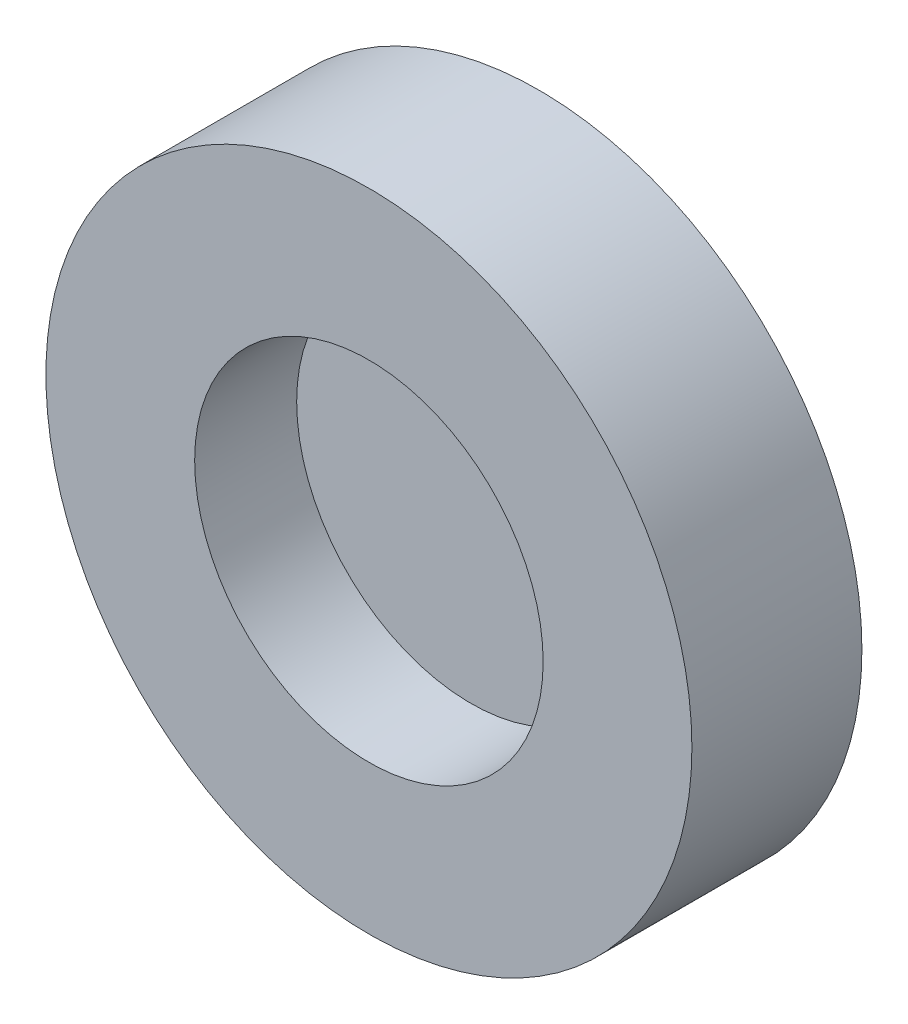
ISO-10303-21;
HEADER;
FILE_DESCRIPTION(('STEP AP214'),'2;1');
FILE_NAME('part.step','',(''),(''),'','','');
FILE_SCHEMA(('AUTOMOTIVE_DESIGN { 1 0 10303 214 1 1 1 1 }'));
ENDSEC;
DATA;
#1=APPLICATION_CONTEXT('core data for automotive mechanical design processes');
#2=APPLICATION_PROTOCOL_DEFINITION('international standard','automotive_design',2000,#1);
#3=PRODUCT_CONTEXT('',#1,'mechanical');
#4=PRODUCT('Part','Part','',(#3));
#5=PRODUCT_RELATED_PRODUCT_CATEGORY('part','',(#4));
#6=PRODUCT_DEFINITION_FORMATION('','',#4);
#7=PRODUCT_DEFINITION_CONTEXT('part definition',#1,'design');
#8=PRODUCT_DEFINITION('design','',#6,#7);
#9=PRODUCT_DEFINITION_SHAPE('','',#8);
#10=(LENGTH_UNIT() NAMED_UNIT(*) SI_UNIT(.MILLI.,.METRE.));
#11=(NAMED_UNIT(*) PLANE_ANGLE_UNIT() SI_UNIT($,.RADIAN.));
#12=(NAMED_UNIT(*) SI_UNIT($,.STERADIAN.) SOLID_ANGLE_UNIT());
#13=UNCERTAINTY_MEASURE_WITH_UNIT(LENGTH_MEASURE(1.E-05),#10,'distance_accuracy_value','');
#14=(GEOMETRIC_REPRESENTATION_CONTEXT(3) GLOBAL_UNCERTAINTY_ASSIGNED_CONTEXT((#13)) GLOBAL_UNIT_ASSIGNED_CONTEXT((#10,
#11,#12)) REPRESENTATION_CONTEXT('',''));
#15=CARTESIAN_POINT('',(0.,0.,0.));
#16=DIRECTION('',(0.,0.,1.));
#17=DIRECTION('',(1.,0.,0.));
#18=AXIS2_PLACEMENT_3D('',#15,#16,#17);
#19=CARTESIAN_POINT('',(0.,0.,10.));
#20=DIRECTION('',(0.,0.,-1.));
#21=DIRECTION('',(-1.,0.,0.));
#22=AXIS2_PLACEMENT_3D('',#19,#20,#21);
#23=CYLINDRICAL_SURFACE('',#22,10.25);
#24=CARTESIAN_POINT('',(0.,0.,10.));
#25=DIRECTION('',(0.,0.,1.));
#26=DIRECTION('',(1.,0.,0.));
#27=AXIS2_PLACEMENT_3D('',#24,#25,#26);
#28=CIRCLE('',#27,10.25);
#29=CARTESIAN_POINT('',(10.25,0.,10.));
#30=VERTEX_POINT('',#29);
#31=EDGE_CURVE('E41',#30,#30,#28,.T.);
#32=ORIENTED_EDGE('',*,*,#31,.T.);
#33=EDGE_LOOP('',(#32));
#34=FACE_BOUND('',#33,.T.);
#35=CARTESIAN_POINT('',(0.,0.,4.));
#36=DIRECTION('',(0.,0.,-1.));
#37=DIRECTION('',(-1.,0.,0.));
#38=AXIS2_PLACEMENT_3D('',#35,#36,#37);
#39=CIRCLE('',#38,10.25);
#40=CARTESIAN_POINT('',(-10.25,0.,4.));
#41=VERTEX_POINT('',#40);
#42=EDGE_CURVE('E45',#41,#41,#39,.T.);
#43=ORIENTED_EDGE('',*,*,#42,.T.);
#44=EDGE_LOOP('',(#43));
#45=FACE_BOUND('',#44,.T.);
#46=ADVANCED_FACE('F30',(#34,#45),#23,.F.);
#47=CARTESIAN_POINT('',(0.,0.,10.));
#48=DIRECTION('',(0.,0.,1.));
#49=DIRECTION('',(1.,0.,0.));
#50=AXIS2_PLACEMENT_3D('',#47,#48,#49);
#51=PLANE('',#50);
#52=CARTESIAN_POINT('',(0.,0.,10.));
#53=DIRECTION('',(0.,0.,1.));
#54=DIRECTION('',(1.,0.,0.));
#55=AXIS2_PLACEMENT_3D('',#52,#53,#54);
#56=CIRCLE('',#55,19.);
#57=CARTESIAN_POINT('',(19.,0.,10.));
#58=VERTEX_POINT('',#57);
#59=EDGE_CURVE('E10',#58,#58,#56,.T.);
#60=ORIENTED_EDGE('',*,*,#59,.T.);
#61=EDGE_LOOP('',(#60));
#62=FACE_BOUND('',#61,.T.);
#63=ORIENTED_EDGE('',*,*,#31,.F.);
#64=EDGE_LOOP('',(#63));
#65=FACE_BOUND('',#64,.T.);
#66=ADVANCED_FACE('F60',(#62,#65),#51,.T.);
#67=CARTESIAN_POINT('',(0.,0.,0.));
#68=DIRECTION('',(0.,0.,1.));
#69=DIRECTION('',(1.,0.,0.));
#70=AXIS2_PLACEMENT_3D('',#67,#68,#69);
#71=PLANE('',#70);
#72=CARTESIAN_POINT('',(0.,0.,0.));
#73=DIRECTION('',(0.,0.,1.));
#74=DIRECTION('',(1.,0.,0.));
#75=AXIS2_PLACEMENT_3D('',#72,#73,#74);
#76=CIRCLE('',#75,19.);
#77=CARTESIAN_POINT('',(19.,0.,0.));
#78=VERTEX_POINT('',#77);
#79=EDGE_CURVE('E34',#78,#78,#76,.T.);
#80=ORIENTED_EDGE('',*,*,#79,.F.);
#81=EDGE_LOOP('',(#80));
#82=FACE_BOUND('',#81,.T.);
#83=ADVANCED_FACE('F56',(#82),#71,.F.);
#84=CARTESIAN_POINT('',(0.,0.,10.));
#85=DIRECTION('',(0.,0.,-1.));
#86=DIRECTION('',(-1.,0.,0.));
#87=AXIS2_PLACEMENT_3D('',#84,#85,#86);
#88=CYLINDRICAL_SURFACE('',#87,19.);
#89=ORIENTED_EDGE('',*,*,#59,.F.);
#90=EDGE_LOOP('',(#89));
#91=FACE_BOUND('',#90,.T.);
#92=ORIENTED_EDGE('',*,*,#79,.T.);
#93=EDGE_LOOP('',(#92));
#94=FACE_BOUND('',#93,.T.);
#95=ADVANCED_FACE('F32',(#91,#94),#88,.T.);
#96=CARTESIAN_POINT('',(0.,0.,4.));
#97=DIRECTION('',(0.,0.,-1.));
#98=DIRECTION('',(-1.,0.,0.));
#99=AXIS2_PLACEMENT_3D('',#96,#97,#98);
#100=PLANE('',#99);
#101=ORIENTED_EDGE('',*,*,#42,.F.);
#102=EDGE_LOOP('',(#101));
#103=FACE_BOUND('',#102,.T.);
#104=ADVANCED_FACE('F50',(#103),#100,.F.);
#105=CLOSED_SHELL('',(#46,#66,#83,#95,#104));
#106=MANIFOLD_SOLID_BREP('B2',#105);
#107=ADVANCED_BREP_SHAPE_REPRESENTATION('',(#18,#106),#14);
#108=SHAPE_DEFINITION_REPRESENTATION(#9,#107);
ENDSEC;
END-ISO-10303-21;
